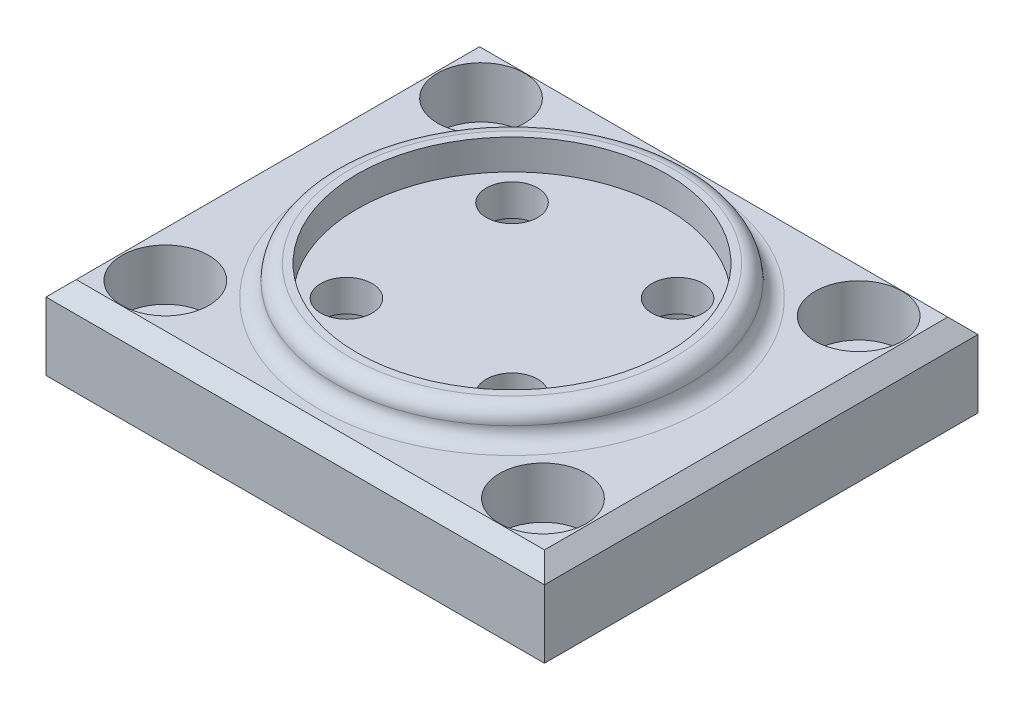
ISO-10303-21;
HEADER;
FILE_DESCRIPTION(('STEP AP214'),'2;1');
FILE_NAME('part.step','',(''),(''),'','','');
FILE_SCHEMA(('AUTOMOTIVE_DESIGN { 1 0 10303 214 1 1 1 1 }'));
ENDSEC;
DATA;
#1=APPLICATION_CONTEXT('core data for automotive mechanical design processes');
#2=APPLICATION_PROTOCOL_DEFINITION('international standard','automotive_design',2000,#1);
#3=PRODUCT_CONTEXT('',#1,'mechanical');
#4=PRODUCT('Part','Part','',(#3));
#5=PRODUCT_RELATED_PRODUCT_CATEGORY('part','',(#4));
#6=PRODUCT_DEFINITION_FORMATION('','',#4);
#7=PRODUCT_DEFINITION_CONTEXT('part definition',#1,'design');
#8=PRODUCT_DEFINITION('design','',#6,#7);
#9=PRODUCT_DEFINITION_SHAPE('','',#8);
#10=(LENGTH_UNIT() NAMED_UNIT(*) SI_UNIT(.MILLI.,.METRE.));
#11=(NAMED_UNIT(*) PLANE_ANGLE_UNIT() SI_UNIT($,.RADIAN.));
#12=(NAMED_UNIT(*) SI_UNIT($,.STERADIAN.) SOLID_ANGLE_UNIT());
#13=UNCERTAINTY_MEASURE_WITH_UNIT(LENGTH_MEASURE(1.E-05),#10,'distance_accuracy_value','');
#14=(GEOMETRIC_REPRESENTATION_CONTEXT(3) GLOBAL_UNCERTAINTY_ASSIGNED_CONTEXT((#13)) GLOBAL_UNIT_ASSIGNED_CONTEXT((#10,
#11,#12)) REPRESENTATION_CONTEXT('',''));
#15=CARTESIAN_POINT('',(0.,0.,0.));
#16=DIRECTION('',(0.,0.,1.));
#17=DIRECTION('',(1.,0.,0.));
#18=AXIS2_PLACEMENT_3D('',#15,#16,#17);
#19=CARTESIAN_POINT('',(0.,5.5,0.));
#20=DIRECTION('',(0.,1.,0.));
#21=DIRECTION('',(0.,0.,1.));
#22=AXIS2_PLACEMENT_3D('',#19,#20,#21);
#23=PLANE('',#22);
#24=CARTESIAN_POINT('',(5.48007755419574,5.5,-5.48007755419574));
#25=DIRECTION('',(0.,-1.,0.));
#26=DIRECTION('',(0.,0.,-1.));
#27=AXIS2_PLACEMENT_3D('',#24,#25,#26);
#28=CIRCLE('',#27,1.7);
#29=CARTESIAN_POINT('',(5.48007755419574,5.5,-7.18007755419574));
#30=VERTEX_POINT('',#29);
#31=EDGE_CURVE('E623',#30,#30,#28,.T.);
#32=ORIENTED_EDGE('',*,*,#31,.T.);
#33=EDGE_LOOP('',(#32));
#34=FACE_BOUND('',#33,.T.);
#35=CARTESIAN_POINT('',(-5.48007755419574,5.5,5.48007755419574));
#36=DIRECTION('',(0.,-1.,0.));
#37=DIRECTION('',(0.,0.,-1.));
#38=AXIS2_PLACEMENT_3D('',#35,#36,#37);
#39=CIRCLE('',#38,1.7);
#40=CARTESIAN_POINT('',(-5.48007755419574,5.5,3.78007755419574));
#41=VERTEX_POINT('',#40);
#42=EDGE_CURVE('E634',#41,#41,#39,.T.);
#43=ORIENTED_EDGE('',*,*,#42,.T.);
#44=EDGE_LOOP('',(#43));
#45=FACE_BOUND('',#44,.T.);
#46=CARTESIAN_POINT('',(-5.48007755419574,5.5,-5.48007755419575));
#47=DIRECTION('',(0.,-1.,0.));
#48=DIRECTION('',(0.,0.,-1.));
#49=AXIS2_PLACEMENT_3D('',#46,#47,#48);
#50=CIRCLE('',#49,1.7);
#51=CARTESIAN_POINT('',(-5.48007755419574,5.5,-7.18007755419575));
#52=VERTEX_POINT('',#51);
#53=EDGE_CURVE('E646',#52,#52,#50,.T.);
#54=ORIENTED_EDGE('',*,*,#53,.T.);
#55=EDGE_LOOP('',(#54));
#56=FACE_BOUND('',#55,.T.);
#57=CARTESIAN_POINT('',(5.48007755419574,5.5,5.48007755419574));
#58=DIRECTION('',(0.,-1.,0.));
#59=DIRECTION('',(0.,0.,-1.));
#60=AXIS2_PLACEMENT_3D('',#57,#58,#59);
#61=CIRCLE('',#60,1.7);
#62=CARTESIAN_POINT('',(5.48007755419574,5.5,3.78007755419575));
#63=VERTEX_POINT('',#62);
#64=EDGE_CURVE('E658',#63,#63,#61,.T.);
#65=ORIENTED_EDGE('',*,*,#64,.T.);
#66=EDGE_LOOP('',(#65));
#67=FACE_BOUND('',#66,.T.);
#68=CARTESIAN_POINT('',(0.,5.5,0.));
#69=DIRECTION('',(0.,1.,0.));
#70=DIRECTION('',(0.,0.,1.));
#71=AXIS2_PLACEMENT_3D('',#68,#69,#70);
#72=CIRCLE('',#71,10.25);
#73=CARTESIAN_POINT('',(0.,5.5,10.25));
#74=VERTEX_POINT('',#73);
#75=EDGE_CURVE('E136',#74,#74,#72,.T.);
#76=ORIENTED_EDGE('',*,*,#75,.T.);
#77=EDGE_LOOP('',(#76));
#78=FACE_BOUND('',#77,.T.);
#79=ADVANCED_FACE('F41',(#34,#45,#56,#67,#78),#23,.T.);
#80=CARTESIAN_POINT('',(-16.5,5.5,14.35));
#81=DIRECTION('',(1.,0.,0.));
#82=DIRECTION('',(0.,0.,-1.));
#83=AXIS2_PLACEMENT_3D('',#80,#81,#82);
#84=PLANE('',#83);
#85=DIRECTION('',(0.,-1.,0.));
#86=VECTOR('',#85,1.);
#87=CARTESIAN_POINT('',(-16.5,5.5,14.35));
#88=LINE('',#87,#86);
#89=CARTESIAN_POINT('',(-16.5,4.5,14.35));
#90=VERTEX_POINT('',#89);
#91=CARTESIAN_POINT('',(-16.5,0.,14.35));
#92=VERTEX_POINT('',#91);
#93=EDGE_CURVE('E93',#90,#92,#88,.T.);
#94=ORIENTED_EDGE('',*,*,#93,.F.);
#95=DIRECTION('',(0.,0.,-1.));
#96=VECTOR('',#95,1.);
#97=CARTESIAN_POINT('',(-16.5,4.5,-14.35));
#98=LINE('',#97,#96);
#99=CARTESIAN_POINT('',(-16.5,4.5,-14.35));
#100=VERTEX_POINT('',#99);
#101=EDGE_CURVE('E51',#90,#100,#98,.T.);
#102=ORIENTED_EDGE('',*,*,#101,.T.);
#103=DIRECTION('',(0.,-1.,0.));
#104=VECTOR('',#103,1.);
#105=CARTESIAN_POINT('',(-16.5,5.5,-14.35));
#106=LINE('',#105,#104);
#107=CARTESIAN_POINT('',(-16.5,0.,-14.35));
#108=VERTEX_POINT('',#107);
#109=EDGE_CURVE('E111',#100,#108,#106,.T.);
#110=ORIENTED_EDGE('',*,*,#109,.T.);
#111=DIRECTION('',(0.,0.,1.));
#112=VECTOR('',#111,1.);
#113=CARTESIAN_POINT('',(-16.5,0.,14.35));
#114=LINE('',#113,#112);
#115=EDGE_CURVE('E106',#108,#92,#114,.T.);
#116=ORIENTED_EDGE('',*,*,#115,.T.);
#117=EDGE_LOOP('',(#94,#102,#110,#116));
#118=FACE_BOUND('',#117,.T.);
#119=ADVANCED_FACE('F110',(#118),#84,.F.);
#120=CARTESIAN_POINT('',(16.5,5.5,14.35));
#121=DIRECTION('',(0.,0.,-1.));
#122=DIRECTION('',(-1.,0.,0.));
#123=AXIS2_PLACEMENT_3D('',#120,#121,#122);
#124=PLANE('',#123);
#125=DIRECTION('',(0.,-1.,0.));
#126=VECTOR('',#125,1.);
#127=CARTESIAN_POINT('',(16.5,5.5,14.35));
#128=LINE('',#127,#126);
#129=CARTESIAN_POINT('',(16.5,4.5,14.35));
#130=VERTEX_POINT('',#129);
#131=CARTESIAN_POINT('',(16.5,0.,14.35));
#132=VERTEX_POINT('',#131);
#133=EDGE_CURVE('E100',#130,#132,#128,.T.);
#134=ORIENTED_EDGE('',*,*,#133,.F.);
#135=DIRECTION('',(-1.,0.,0.));
#136=VECTOR('',#135,1.);
#137=CARTESIAN_POINT('',(-16.5,4.5,14.35));
#138=LINE('',#137,#136);
#139=EDGE_CURVE('E11',#130,#90,#138,.T.);
#140=ORIENTED_EDGE('',*,*,#139,.T.);
#141=ORIENTED_EDGE('',*,*,#93,.T.);
#142=DIRECTION('',(1.,0.,0.));
#143=VECTOR('',#142,1.);
#144=CARTESIAN_POINT('',(16.5,0.,14.35));
#145=LINE('',#144,#143);
#146=EDGE_CURVE('E96',#92,#132,#145,.T.);
#147=ORIENTED_EDGE('',*,*,#146,.T.);
#148=EDGE_LOOP('',(#134,#140,#141,#147));
#149=FACE_BOUND('',#148,.T.);
#150=ADVANCED_FACE('F95',(#149),#124,.F.);
#151=CARTESIAN_POINT('',(16.5,5.5,14.35));
#152=DIRECTION('',(-1.,0.,0.));
#153=DIRECTION('',(0.,0.,1.));
#154=AXIS2_PLACEMENT_3D('',#151,#152,#153);
#155=PLANE('',#154);
#156=DIRECTION('',(0.,-1.,0.));
#157=VECTOR('',#156,1.);
#158=CARTESIAN_POINT('',(16.5,5.5,-14.35));
#159=LINE('',#158,#157);
#160=CARTESIAN_POINT('',(16.5,4.5,-14.35));
#161=VERTEX_POINT('',#160);
#162=CARTESIAN_POINT('',(16.5,0.,-14.35));
#163=VERTEX_POINT('',#162);
#164=EDGE_CURVE('E124',#161,#163,#159,.T.);
#165=ORIENTED_EDGE('',*,*,#164,.F.);
#166=DIRECTION('',(0.,0.,1.));
#167=VECTOR('',#166,1.);
#168=CARTESIAN_POINT('',(16.5,4.5,14.35));
#169=LINE('',#168,#167);
#170=EDGE_CURVE('E145',#161,#130,#169,.T.);
#171=ORIENTED_EDGE('',*,*,#170,.T.);
#172=ORIENTED_EDGE('',*,*,#133,.T.);
#173=DIRECTION('',(0.,0.,-1.));
#174=VECTOR('',#173,1.);
#175=CARTESIAN_POINT('',(16.5,0.,14.35));
#176=LINE('',#175,#174);
#177=EDGE_CURVE('E108',#132,#163,#176,.T.);
#178=ORIENTED_EDGE('',*,*,#177,.T.);
#179=EDGE_LOOP('',(#165,#171,#172,#178));
#180=FACE_BOUND('',#179,.T.);
#181=ADVANCED_FACE('F175',(#180),#155,.F.);
#182=CARTESIAN_POINT('',(16.5,5.5,-14.35));
#183=DIRECTION('',(0.,0.,1.));
#184=DIRECTION('',(1.,0.,0.));
#185=AXIS2_PLACEMENT_3D('',#182,#183,#184);
#186=PLANE('',#185);
#187=ORIENTED_EDGE('',*,*,#109,.F.);
#188=DIRECTION('',(1.,0.,0.));
#189=VECTOR('',#188,1.);
#190=CARTESIAN_POINT('',(16.5,4.5,-14.35));
#191=LINE('',#190,#189);
#192=EDGE_CURVE('E148',#100,#161,#191,.T.);
#193=ORIENTED_EDGE('',*,*,#192,.T.);
#194=ORIENTED_EDGE('',*,*,#164,.T.);
#195=DIRECTION('',(-1.,0.,0.));
#196=VECTOR('',#195,1.);
#197=CARTESIAN_POINT('',(16.5,0.,-14.35));
#198=LINE('',#197,#196);
#199=EDGE_CURVE('E121',#163,#108,#198,.T.);
#200=ORIENTED_EDGE('',*,*,#199,.T.);
#201=EDGE_LOOP('',(#187,#193,#194,#200));
#202=FACE_BOUND('',#201,.T.);
#203=ADVANCED_FACE('F172',(#202),#186,.F.);
#204=DIRECTION('',(1.,0.,0.));
#205=VECTOR('',#204,1.);
#206=CARTESIAN_POINT('',(16.5,5.5,13.35));
#207=LINE('',#206,#205);
#208=CARTESIAN_POINT('',(-15.5,5.5,13.35));
#209=VERTEX_POINT('',#208);
#210=CARTESIAN_POINT('',(15.5,5.5,13.35));
#211=VERTEX_POINT('',#210);
#212=EDGE_CURVE('E132',#209,#211,#207,.T.);
#213=ORIENTED_EDGE('',*,*,#212,.T.);
#214=DIRECTION('',(0.,0.,-1.));
#215=VECTOR('',#214,1.);
#216=CARTESIAN_POINT('',(15.5,5.5,-14.35));
#217=LINE('',#216,#215);
#218=CARTESIAN_POINT('',(15.5,5.5,-13.35));
#219=VERTEX_POINT('',#218);
#220=EDGE_CURVE('E142',#211,#219,#217,.T.);
#221=ORIENTED_EDGE('',*,*,#220,.T.);
#222=DIRECTION('',(-1.,0.,0.));
#223=VECTOR('',#222,1.);
#224=CARTESIAN_POINT('',(-16.5,5.5,-13.35));
#225=LINE('',#224,#223);
#226=CARTESIAN_POINT('',(-15.5,5.5,-13.35));
#227=VERTEX_POINT('',#226);
#228=EDGE_CURVE('E140',#219,#227,#225,.T.);
#229=ORIENTED_EDGE('',*,*,#228,.T.);
#230=DIRECTION('',(0.,0.,1.));
#231=VECTOR('',#230,1.);
#232=CARTESIAN_POINT('',(-15.5,5.5,14.35));
#233=LINE('',#232,#231);
#234=EDGE_CURVE('E138',#227,#209,#233,.T.);
#235=ORIENTED_EDGE('',*,*,#234,.T.);
#236=EDGE_LOOP('',(#213,#221,#229,#235));
#237=FACE_BOUND('',#236,.T.);
#238=CARTESIAN_POINT('',(0.,5.5,0.));
#239=DIRECTION('',(0.,1.,0.));
#240=DIRECTION('',(0.,0.,1.));
#241=AXIS2_PLACEMENT_3D('',#238,#239,#240);
#242=CIRCLE('',#241,12.75);
#243=CARTESIAN_POINT('',(0.,5.5,12.75));
#244=VERTEX_POINT('',#243);
#245=EDGE_CURVE('E129',#244,#244,#242,.F.);
#246=ORIENTED_EDGE('',*,*,#245,.T.);
#247=EDGE_LOOP('',(#246));
#248=FACE_BOUND('',#247,.T.);
#249=CARTESIAN_POINT('',(-12.5,5.5,-10.45));
#250=DIRECTION('',(0.,1.,0.));
#251=DIRECTION('',(0.,0.,1.));
#252=AXIS2_PLACEMENT_3D('',#249,#250,#251);
#253=CIRCLE('',#252,2.875);
#254=CARTESIAN_POINT('',(-12.5,5.5,-7.57499999999999));
#255=VERTEX_POINT('',#254);
#256=EDGE_CURVE('E189',#255,#255,#253,.T.);
#257=ORIENTED_EDGE('',*,*,#256,.F.);
#258=EDGE_LOOP('',(#257));
#259=FACE_BOUND('',#258,.T.);
#260=CARTESIAN_POINT('',(12.5,5.5,10.45));
#261=DIRECTION('',(0.,1.,0.));
#262=DIRECTION('',(0.,0.,1.));
#263=AXIS2_PLACEMENT_3D('',#260,#261,#262);
#264=CIRCLE('',#263,2.875);
#265=CARTESIAN_POINT('',(12.5,5.5,13.325));
#266=VERTEX_POINT('',#265);
#267=EDGE_CURVE('E193',#266,#266,#264,.T.);
#268=ORIENTED_EDGE('',*,*,#267,.F.);
#269=EDGE_LOOP('',(#268));
#270=FACE_BOUND('',#269,.T.);
#271=CARTESIAN_POINT('',(12.5,5.5,-10.45));
#272=DIRECTION('',(0.,1.,0.));
#273=DIRECTION('',(0.,0.,1.));
#274=AXIS2_PLACEMENT_3D('',#271,#272,#273);
#275=CIRCLE('',#274,2.875);
#276=CARTESIAN_POINT('',(12.5,5.5,-7.575));
#277=VERTEX_POINT('',#276);
#278=EDGE_CURVE('E197',#277,#277,#275,.T.);
#279=ORIENTED_EDGE('',*,*,#278,.F.);
#280=EDGE_LOOP('',(#279));
#281=FACE_BOUND('',#280,.T.);
#282=CARTESIAN_POINT('',(-12.5,5.5,10.45));
#283=DIRECTION('',(0.,1.,0.));
#284=DIRECTION('',(0.,0.,1.));
#285=AXIS2_PLACEMENT_3D('',#282,#283,#284);
#286=CIRCLE('',#285,2.875);
#287=CARTESIAN_POINT('',(-12.5,5.5,13.325));
#288=VERTEX_POINT('',#287);
#289=EDGE_CURVE('E200',#288,#288,#286,.T.);
#290=ORIENTED_EDGE('',*,*,#289,.F.);
#291=EDGE_LOOP('',(#290));
#292=FACE_BOUND('',#291,.T.);
#293=ADVANCED_FACE('F180',(#237,#248,#259,#270,#281,#292),#23,.T.);
#294=CARTESIAN_POINT('',(0.,0.,0.));
#295=DIRECTION('',(0.,1.,0.));
#296=DIRECTION('',(0.,0.,1.));
#297=AXIS2_PLACEMENT_3D('',#294,#295,#296);
#298=PLANE('',#297);
#299=CARTESIAN_POINT('',(5.48007755419574,0.,5.48007755419574));
#300=DIRECTION('',(0.,-1.,0.));
#301=DIRECTION('',(0.,0.,-1.));
#302=AXIS2_PLACEMENT_3D('',#299,#300,#301);
#303=CIRCLE('',#302,2.87499999999999);
#304=CARTESIAN_POINT('',(5.48007755419574,0.,2.60507755419575));
#305=VERTEX_POINT('',#304);
#306=EDGE_CURVE('E667',#305,#305,#303,.T.);
#307=ORIENTED_EDGE('',*,*,#306,.F.);
#308=EDGE_LOOP('',(#307));
#309=FACE_BOUND('',#308,.T.);
#310=CARTESIAN_POINT('',(-5.48007755419574,0.,-5.48007755419575));
#311=DIRECTION('',(0.,-1.,0.));
#312=DIRECTION('',(0.,0.,-1.));
#313=AXIS2_PLACEMENT_3D('',#310,#311,#312);
#314=CIRCLE('',#313,2.875);
#315=CARTESIAN_POINT('',(-5.48007755419574,0.,-8.35507755419574));
#316=VERTEX_POINT('',#315);
#317=EDGE_CURVE('E655',#316,#316,#314,.T.);
#318=ORIENTED_EDGE('',*,*,#317,.F.);
#319=EDGE_LOOP('',(#318));
#320=FACE_BOUND('',#319,.T.);
#321=CARTESIAN_POINT('',(-5.48007755419574,0.,5.48007755419574));
#322=DIRECTION('',(0.,-1.,0.));
#323=DIRECTION('',(0.,0.,-1.));
#324=AXIS2_PLACEMENT_3D('',#321,#322,#323);
#325=CIRCLE('',#324,2.875);
#326=CARTESIAN_POINT('',(-5.48007755419574,0.,2.60507755419575));
#327=VERTEX_POINT('',#326);
#328=EDGE_CURVE('E643',#327,#327,#325,.T.);
#329=ORIENTED_EDGE('',*,*,#328,.F.);
#330=EDGE_LOOP('',(#329));
#331=FACE_BOUND('',#330,.T.);
#332=CARTESIAN_POINT('',(5.48007755419574,0.,-5.48007755419574));
#333=DIRECTION('',(0.,-1.,0.));
#334=DIRECTION('',(0.,0.,-1.));
#335=AXIS2_PLACEMENT_3D('',#332,#333,#334);
#336=CIRCLE('',#335,2.875);
#337=CARTESIAN_POINT('',(5.48007755419574,0.,-8.35507755419574));
#338=VERTEX_POINT('',#337);
#339=EDGE_CURVE('E631',#338,#338,#336,.T.);
#340=ORIENTED_EDGE('',*,*,#339,.F.);
#341=EDGE_LOOP('',(#340));
#342=FACE_BOUND('',#341,.T.);
#343=CARTESIAN_POINT('',(-12.5,0.,-10.45));
#344=DIRECTION('',(0.,1.,0.));
#345=DIRECTION('',(0.,0.,1.));
#346=AXIS2_PLACEMENT_3D('',#343,#344,#345);
#347=CIRCLE('',#346,1.7);
#348=CARTESIAN_POINT('',(-12.5,0.,-8.75));
#349=VERTEX_POINT('',#348);
#350=EDGE_CURVE('E613',#349,#349,#347,.T.);
#351=ORIENTED_EDGE('',*,*,#350,.T.);
#352=EDGE_LOOP('',(#351));
#353=FACE_BOUND('',#352,.T.);
#354=CARTESIAN_POINT('',(12.5,0.,10.45));
#355=DIRECTION('',(0.,1.,0.));
#356=DIRECTION('',(0.,0.,1.));
#357=AXIS2_PLACEMENT_3D('',#354,#355,#356);
#358=CIRCLE('',#357,1.7);
#359=CARTESIAN_POINT('',(12.5,0.,12.15));
#360=VERTEX_POINT('',#359);
#361=EDGE_CURVE('E601',#360,#360,#358,.T.);
#362=ORIENTED_EDGE('',*,*,#361,.T.);
#363=EDGE_LOOP('',(#362));
#364=FACE_BOUND('',#363,.T.);
#365=CARTESIAN_POINT('',(12.5,0.,-10.45));
#366=DIRECTION('',(0.,1.,0.));
#367=DIRECTION('',(0.,0.,1.));
#368=AXIS2_PLACEMENT_3D('',#365,#366,#367);
#369=CIRCLE('',#368,1.7);
#370=CARTESIAN_POINT('',(12.5,0.,-8.75));
#371=VERTEX_POINT('',#370);
#372=EDGE_CURVE('E203',#371,#371,#369,.T.);
#373=ORIENTED_EDGE('',*,*,#372,.T.);
#374=EDGE_LOOP('',(#373));
#375=FACE_BOUND('',#374,.T.);
#376=CARTESIAN_POINT('',(-12.5,0.,10.45));
#377=DIRECTION('',(0.,1.,0.));
#378=DIRECTION('',(0.,0.,1.));
#379=AXIS2_PLACEMENT_3D('',#376,#377,#378);
#380=CIRCLE('',#379,1.7);
#381=CARTESIAN_POINT('',(-12.5,0.,12.15));
#382=VERTEX_POINT('',#381);
#383=EDGE_CURVE('E113',#382,#382,#380,.T.);
#384=ORIENTED_EDGE('',*,*,#383,.T.);
#385=EDGE_LOOP('',(#384));
#386=FACE_BOUND('',#385,.T.);
#387=ORIENTED_EDGE('',*,*,#115,.F.);
#388=ORIENTED_EDGE('',*,*,#199,.F.);
#389=ORIENTED_EDGE('',*,*,#177,.F.);
#390=ORIENTED_EDGE('',*,*,#146,.F.);
#391=EDGE_LOOP('',(#387,#388,#389,#390));
#392=FACE_BOUND('',#391,.T.);
#393=ADVANCED_FACE('F104',(#309,#320,#331,#342,#353,#364,#375,#386,#392),#298,.F.);
#394=CARTESIAN_POINT('',(-12.5,5.5,10.45));
#395=DIRECTION('',(0.,1.,0.));
#396=DIRECTION('',(0.,0.,1.));
#397=AXIS2_PLACEMENT_3D('',#394,#395,#396);
#398=CYLINDRICAL_SURFACE('',#397,1.7);
#399=ORIENTED_EDGE('',*,*,#383,.F.);
#400=EDGE_LOOP('',(#399));
#401=FACE_BOUND('',#400,.T.);
#402=CARTESIAN_POINT('',(-12.5,2.1,10.45));
#403=DIRECTION('',(0.,1.,0.));
#404=DIRECTION('',(0.,0.,1.));
#405=AXIS2_PLACEMENT_3D('',#402,#403,#404);
#406=CIRCLE('',#405,1.7);
#407=CARTESIAN_POINT('',(-12.5,2.1,12.15));
#408=VERTEX_POINT('',#407);
#409=EDGE_CURVE('E116',#408,#408,#406,.T.);
#410=ORIENTED_EDGE('',*,*,#409,.T.);
#411=EDGE_LOOP('',(#410));
#412=FACE_BOUND('',#411,.T.);
#413=ADVANCED_FACE('F214',(#401,#412),#398,.F.);
#414=CARTESIAN_POINT('',(-10.8,2.1,10.45));
#415=DIRECTION('',(0.,-1.,0.));
#416=DIRECTION('',(0.,0.,-1.));
#417=AXIS2_PLACEMENT_3D('',#414,#415,#416);
#418=PLANE('',#417);
#419=ORIENTED_EDGE('',*,*,#409,.F.);
#420=EDGE_LOOP('',(#419));
#421=FACE_BOUND('',#420,.T.);
#422=CARTESIAN_POINT('',(-12.5,2.1,10.45));
#423=DIRECTION('',(0.,1.,0.));
#424=DIRECTION('',(0.,0.,1.));
#425=AXIS2_PLACEMENT_3D('',#422,#423,#424);
#426=CIRCLE('',#425,2.875);
#427=CARTESIAN_POINT('',(-12.5,2.1,13.325));
#428=VERTEX_POINT('',#427);
#429=EDGE_CURVE('E202',#428,#428,#426,.T.);
#430=ORIENTED_EDGE('',*,*,#429,.T.);
#431=EDGE_LOOP('',(#430));
#432=FACE_BOUND('',#431,.T.);
#433=ADVANCED_FACE('F216',(#421,#432),#418,.F.);
#434=CARTESIAN_POINT('',(-12.5,5.5,10.45));
#435=DIRECTION('',(0.,1.,0.));
#436=DIRECTION('',(0.,0.,1.));
#437=AXIS2_PLACEMENT_3D('',#434,#435,#436);
#438=CYLINDRICAL_SURFACE('',#437,2.875);
#439=ORIENTED_EDGE('',*,*,#429,.F.);
#440=EDGE_LOOP('',(#439));
#441=FACE_BOUND('',#440,.T.);
#442=ORIENTED_EDGE('',*,*,#289,.T.);
#443=EDGE_LOOP('',(#442));
#444=FACE_BOUND('',#443,.T.);
#445=ADVANCED_FACE('F219',(#441,#444),#438,.F.);
#446=CARTESIAN_POINT('',(12.5,5.5,-10.45));
#447=DIRECTION('',(0.,1.,0.));
#448=DIRECTION('',(0.,0.,1.));
#449=AXIS2_PLACEMENT_3D('',#446,#447,#448);
#450=CYLINDRICAL_SURFACE('',#449,1.7);
#451=ORIENTED_EDGE('',*,*,#372,.F.);
#452=EDGE_LOOP('',(#451));
#453=FACE_BOUND('',#452,.T.);
#454=CARTESIAN_POINT('',(12.5,2.1,-10.45));
#455=DIRECTION('',(0.,1.,0.));
#456=DIRECTION('',(0.,0.,1.));
#457=AXIS2_PLACEMENT_3D('',#454,#455,#456);
#458=CIRCLE('',#457,1.7);
#459=CARTESIAN_POINT('',(12.5,2.1,-8.75));
#460=VERTEX_POINT('',#459);
#461=EDGE_CURVE('E208',#460,#460,#458,.T.);
#462=ORIENTED_EDGE('',*,*,#461,.T.);
#463=EDGE_LOOP('',(#462));
#464=FACE_BOUND('',#463,.T.);
#465=ADVANCED_FACE('F224',(#453,#464),#450,.F.);
#466=CARTESIAN_POINT('',(14.2,2.1,-10.45));
#467=DIRECTION('',(0.,-1.,0.));
#468=DIRECTION('',(0.,0.,-1.));
#469=AXIS2_PLACEMENT_3D('',#466,#467,#468);
#470=PLANE('',#469);
#471=ORIENTED_EDGE('',*,*,#461,.F.);
#472=EDGE_LOOP('',(#471));
#473=FACE_BOUND('',#472,.T.);
#474=CARTESIAN_POINT('',(12.5,2.1,-10.45));
#475=DIRECTION('',(0.,1.,0.));
#476=DIRECTION('',(0.,0.,1.));
#477=AXIS2_PLACEMENT_3D('',#474,#475,#476);
#478=CIRCLE('',#477,2.875);
#479=CARTESIAN_POINT('',(12.5,2.1,-7.575));
#480=VERTEX_POINT('',#479);
#481=EDGE_CURVE('E599',#480,#480,#478,.T.);
#482=ORIENTED_EDGE('',*,*,#481,.T.);
#483=EDGE_LOOP('',(#482));
#484=FACE_BOUND('',#483,.T.);
#485=ADVANCED_FACE('F229',(#473,#484),#470,.F.);
#486=CARTESIAN_POINT('',(12.5,5.5,-10.45));
#487=DIRECTION('',(0.,1.,0.));
#488=DIRECTION('',(0.,0.,1.));
#489=AXIS2_PLACEMENT_3D('',#486,#487,#488);
#490=CYLINDRICAL_SURFACE('',#489,2.875);
#491=ORIENTED_EDGE('',*,*,#481,.F.);
#492=EDGE_LOOP('',(#491));
#493=FACE_BOUND('',#492,.T.);
#494=ORIENTED_EDGE('',*,*,#278,.T.);
#495=EDGE_LOOP('',(#494));
#496=FACE_BOUND('',#495,.T.);
#497=ADVANCED_FACE('F518',(#493,#496),#490,.F.);
#498=CARTESIAN_POINT('',(12.5,5.5,10.45));
#499=DIRECTION('',(0.,1.,0.));
#500=DIRECTION('',(0.,0.,1.));
#501=AXIS2_PLACEMENT_3D('',#498,#499,#500);
#502=CYLINDRICAL_SURFACE('',#501,1.7);
#503=ORIENTED_EDGE('',*,*,#361,.F.);
#504=EDGE_LOOP('',(#503));
#505=FACE_BOUND('',#504,.T.);
#506=CARTESIAN_POINT('',(12.5,2.1,10.45));
#507=DIRECTION('',(0.,1.,0.));
#508=DIRECTION('',(0.,0.,1.));
#509=AXIS2_PLACEMENT_3D('',#506,#507,#508);
#510=CIRCLE('',#509,1.7);
#511=CARTESIAN_POINT('',(12.5,2.1,12.15));
#512=VERTEX_POINT('',#511);
#513=EDGE_CURVE('E606',#512,#512,#510,.T.);
#514=ORIENTED_EDGE('',*,*,#513,.T.);
#515=EDGE_LOOP('',(#514));
#516=FACE_BOUND('',#515,.T.);
#517=ADVANCED_FACE('F509',(#505,#516),#502,.F.);
#518=CARTESIAN_POINT('',(14.2,2.1,10.45));
#519=DIRECTION('',(0.,-1.,0.));
#520=DIRECTION('',(0.,0.,-1.));
#521=AXIS2_PLACEMENT_3D('',#518,#519,#520);
#522=PLANE('',#521);
#523=ORIENTED_EDGE('',*,*,#513,.F.);
#524=EDGE_LOOP('',(#523));
#525=FACE_BOUND('',#524,.T.);
#526=CARTESIAN_POINT('',(12.5,2.1,10.45));
#527=DIRECTION('',(0.,1.,0.));
#528=DIRECTION('',(0.,0.,1.));
#529=AXIS2_PLACEMENT_3D('',#526,#527,#528);
#530=CIRCLE('',#529,2.875);
#531=CARTESIAN_POINT('',(12.5,2.1,13.325));
#532=VERTEX_POINT('',#531);
#533=EDGE_CURVE('E609',#532,#532,#530,.T.);
#534=ORIENTED_EDGE('',*,*,#533,.T.);
#535=EDGE_LOOP('',(#534));
#536=FACE_BOUND('',#535,.T.);
#537=ADVANCED_FACE('F500',(#525,#536),#522,.F.);
#538=CARTESIAN_POINT('',(12.5,5.5,10.45));
#539=DIRECTION('',(0.,1.,0.));
#540=DIRECTION('',(0.,0.,1.));
#541=AXIS2_PLACEMENT_3D('',#538,#539,#540);
#542=CYLINDRICAL_SURFACE('',#541,2.875);
#543=ORIENTED_EDGE('',*,*,#533,.F.);
#544=EDGE_LOOP('',(#543));
#545=FACE_BOUND('',#544,.T.);
#546=ORIENTED_EDGE('',*,*,#267,.T.);
#547=EDGE_LOOP('',(#546));
#548=FACE_BOUND('',#547,.T.);
#549=ADVANCED_FACE('F491',(#545,#548),#542,.F.);
#550=CARTESIAN_POINT('',(-12.5,5.5,-10.45));
#551=DIRECTION('',(0.,1.,0.));
#552=DIRECTION('',(0.,0.,1.));
#553=AXIS2_PLACEMENT_3D('',#550,#551,#552);
#554=CYLINDRICAL_SURFACE('',#553,1.7);
#555=ORIENTED_EDGE('',*,*,#350,.F.);
#556=EDGE_LOOP('',(#555));
#557=FACE_BOUND('',#556,.T.);
#558=CARTESIAN_POINT('',(-12.5,2.1,-10.45));
#559=DIRECTION('',(0.,1.,0.));
#560=DIRECTION('',(0.,0.,1.));
#561=AXIS2_PLACEMENT_3D('',#558,#559,#560);
#562=CIRCLE('',#561,1.7);
#563=CARTESIAN_POINT('',(-12.5,2.1,-8.75));
#564=VERTEX_POINT('',#563);
#565=EDGE_CURVE('E616',#564,#564,#562,.T.);
#566=ORIENTED_EDGE('',*,*,#565,.T.);
#567=EDGE_LOOP('',(#566));
#568=FACE_BOUND('',#567,.T.);
#569=ADVANCED_FACE('F482',(#557,#568),#554,.F.);
#570=CARTESIAN_POINT('',(-10.8,2.1,-10.45));
#571=DIRECTION('',(0.,-1.,0.));
#572=DIRECTION('',(0.,0.,-1.));
#573=AXIS2_PLACEMENT_3D('',#570,#571,#572);
#574=PLANE('',#573);
#575=ORIENTED_EDGE('',*,*,#565,.F.);
#576=EDGE_LOOP('',(#575));
#577=FACE_BOUND('',#576,.T.);
#578=CARTESIAN_POINT('',(-12.5,2.1,-10.45));
#579=DIRECTION('',(0.,1.,0.));
#580=DIRECTION('',(0.,0.,1.));
#581=AXIS2_PLACEMENT_3D('',#578,#579,#580);
#582=CIRCLE('',#581,2.875);
#583=CARTESIAN_POINT('',(-12.5,2.1,-7.57499999999999));
#584=VERTEX_POINT('',#583);
#585=EDGE_CURVE('E619',#584,#584,#582,.T.);
#586=ORIENTED_EDGE('',*,*,#585,.T.);
#587=EDGE_LOOP('',(#586));
#588=FACE_BOUND('',#587,.T.);
#589=ADVANCED_FACE('F473',(#577,#588),#574,.F.);
#590=CARTESIAN_POINT('',(-12.5,5.5,-10.45));
#591=DIRECTION('',(0.,1.,0.));
#592=DIRECTION('',(0.,0.,1.));
#593=AXIS2_PLACEMENT_3D('',#590,#591,#592);
#594=CYLINDRICAL_SURFACE('',#593,2.875);
#595=ORIENTED_EDGE('',*,*,#585,.F.);
#596=EDGE_LOOP('',(#595));
#597=FACE_BOUND('',#596,.T.);
#598=ORIENTED_EDGE('',*,*,#256,.T.);
#599=EDGE_LOOP('',(#598));
#600=FACE_BOUND('',#599,.T.);
#601=ADVANCED_FACE('F464',(#597,#600),#594,.F.);
#602=CARTESIAN_POINT('',(5.48007755419574,0.,-5.48007755419574));
#603=DIRECTION('',(0.,-1.,0.));
#604=DIRECTION('',(0.,0.,-1.));
#605=AXIS2_PLACEMENT_3D('',#602,#603,#604);
#606=CYLINDRICAL_SURFACE('',#605,1.70000000000001);
#607=ORIENTED_EDGE('',*,*,#31,.F.);
#608=EDGE_LOOP('',(#607));
#609=FACE_BOUND('',#608,.T.);
#610=CARTESIAN_POINT('',(5.48007755419574,3.4,-5.48007755419574));
#611=DIRECTION('',(0.,-1.,0.));
#612=DIRECTION('',(0.,0.,-1.));
#613=AXIS2_PLACEMENT_3D('',#610,#611,#612);
#614=CIRCLE('',#613,1.70000000000001);
#615=CARTESIAN_POINT('',(5.48007755419574,3.4,-7.18007755419576));
#616=VERTEX_POINT('',#615);
#617=EDGE_CURVE('E625',#616,#616,#614,.T.);
#618=ORIENTED_EDGE('',*,*,#617,.T.);
#619=EDGE_LOOP('',(#618));
#620=FACE_BOUND('',#619,.T.);
#621=ADVANCED_FACE('F455',(#609,#620),#606,.F.);
#622=CARTESIAN_POINT('',(7.18007755419576,3.4,-5.48007755419574));
#623=DIRECTION('',(0.,1.,0.));
#624=DIRECTION('',(0.,0.,1.));
#625=AXIS2_PLACEMENT_3D('',#622,#623,#624);
#626=PLANE('',#625);
#627=ORIENTED_EDGE('',*,*,#617,.F.);
#628=EDGE_LOOP('',(#627));
#629=FACE_BOUND('',#628,.T.);
#630=CARTESIAN_POINT('',(5.48007755419574,3.4,-5.48007755419574));
#631=DIRECTION('',(0.,-1.,0.));
#632=DIRECTION('',(0.,0.,-1.));
#633=AXIS2_PLACEMENT_3D('',#630,#631,#632);
#634=CIRCLE('',#633,2.875);
#635=CARTESIAN_POINT('',(5.48007755419574,3.4,-8.35507755419574));
#636=VERTEX_POINT('',#635);
#637=EDGE_CURVE('E628',#636,#636,#634,.T.);
#638=ORIENTED_EDGE('',*,*,#637,.T.);
#639=EDGE_LOOP('',(#638));
#640=FACE_BOUND('',#639,.T.);
#641=ADVANCED_FACE('F446',(#629,#640),#626,.F.);
#642=CARTESIAN_POINT('',(5.48007755419574,0.,-5.48007755419574));
#643=DIRECTION('',(0.,-1.,0.));
#644=DIRECTION('',(0.,0.,-1.));
#645=AXIS2_PLACEMENT_3D('',#642,#643,#644);
#646=CYLINDRICAL_SURFACE('',#645,2.875);
#647=ORIENTED_EDGE('',*,*,#637,.F.);
#648=EDGE_LOOP('',(#647));
#649=FACE_BOUND('',#648,.T.);
#650=ORIENTED_EDGE('',*,*,#339,.T.);
#651=EDGE_LOOP('',(#650));
#652=FACE_BOUND('',#651,.T.);
#653=ADVANCED_FACE('F437',(#649,#652),#646,.F.);
#654=CARTESIAN_POINT('',(-5.48007755419574,0.,5.48007755419574));
#655=DIRECTION('',(0.,-1.,0.));
#656=DIRECTION('',(0.,0.,-1.));
#657=AXIS2_PLACEMENT_3D('',#654,#655,#656);
#658=CYLINDRICAL_SURFACE('',#657,1.70000000000001);
#659=ORIENTED_EDGE('',*,*,#42,.F.);
#660=EDGE_LOOP('',(#659));
#661=FACE_BOUND('',#660,.T.);
#662=CARTESIAN_POINT('',(-5.48007755419574,3.4,5.48007755419574));
#663=DIRECTION('',(0.,-1.,0.));
#664=DIRECTION('',(0.,0.,-1.));
#665=AXIS2_PLACEMENT_3D('',#662,#663,#664);
#666=CIRCLE('',#665,1.70000000000001);
#667=CARTESIAN_POINT('',(-5.48007755419574,3.4,3.78007755419573));
#668=VERTEX_POINT('',#667);
#669=EDGE_CURVE('E637',#668,#668,#666,.T.);
#670=ORIENTED_EDGE('',*,*,#669,.T.);
#671=EDGE_LOOP('',(#670));
#672=FACE_BOUND('',#671,.T.);
#673=ADVANCED_FACE('F428',(#661,#672),#658,.F.);
#674=CARTESIAN_POINT('',(-3.78007755419573,3.4,5.48007755419574));
#675=DIRECTION('',(0.,1.,0.));
#676=DIRECTION('',(0.,0.,1.));
#677=AXIS2_PLACEMENT_3D('',#674,#675,#676);
#678=PLANE('',#677);
#679=ORIENTED_EDGE('',*,*,#669,.F.);
#680=EDGE_LOOP('',(#679));
#681=FACE_BOUND('',#680,.T.);
#682=CARTESIAN_POINT('',(-5.48007755419574,3.4,5.48007755419574));
#683=DIRECTION('',(0.,-1.,0.));
#684=DIRECTION('',(0.,0.,-1.));
#685=AXIS2_PLACEMENT_3D('',#682,#683,#684);
#686=CIRCLE('',#685,2.875);
#687=CARTESIAN_POINT('',(-5.48007755419574,3.4,2.60507755419575));
#688=VERTEX_POINT('',#687);
#689=EDGE_CURVE('E640',#688,#688,#686,.T.);
#690=ORIENTED_EDGE('',*,*,#689,.T.);
#691=EDGE_LOOP('',(#690));
#692=FACE_BOUND('',#691,.T.);
#693=ADVANCED_FACE('F419',(#681,#692),#678,.F.);
#694=CARTESIAN_POINT('',(-5.48007755419574,0.,5.48007755419574));
#695=DIRECTION('',(0.,-1.,0.));
#696=DIRECTION('',(0.,0.,-1.));
#697=AXIS2_PLACEMENT_3D('',#694,#695,#696);
#698=CYLINDRICAL_SURFACE('',#697,2.875);
#699=ORIENTED_EDGE('',*,*,#689,.F.);
#700=EDGE_LOOP('',(#699));
#701=FACE_BOUND('',#700,.T.);
#702=ORIENTED_EDGE('',*,*,#328,.T.);
#703=EDGE_LOOP('',(#702));
#704=FACE_BOUND('',#703,.T.);
#705=ADVANCED_FACE('F410',(#701,#704),#698,.F.);
#706=CARTESIAN_POINT('',(-5.48007755419574,0.,-5.48007755419575));
#707=DIRECTION('',(0.,-1.,0.));
#708=DIRECTION('',(0.,0.,-1.));
#709=AXIS2_PLACEMENT_3D('',#706,#707,#708);
#710=CYLINDRICAL_SURFACE('',#709,1.70000000000001);
#711=ORIENTED_EDGE('',*,*,#53,.F.);
#712=EDGE_LOOP('',(#711));
#713=FACE_BOUND('',#712,.T.);
#714=CARTESIAN_POINT('',(-5.48007755419574,3.4,-5.48007755419575));
#715=DIRECTION('',(0.,-1.,0.));
#716=DIRECTION('',(0.,0.,-1.));
#717=AXIS2_PLACEMENT_3D('',#714,#715,#716);
#718=CIRCLE('',#717,1.70000000000001);
#719=CARTESIAN_POINT('',(-5.48007755419574,3.4,-7.18007755419576));
#720=VERTEX_POINT('',#719);
#721=EDGE_CURVE('E649',#720,#720,#718,.T.);
#722=ORIENTED_EDGE('',*,*,#721,.T.);
#723=EDGE_LOOP('',(#722));
#724=FACE_BOUND('',#723,.T.);
#725=ADVANCED_FACE('F401',(#713,#724),#710,.F.);
#726=CARTESIAN_POINT('',(-3.78007755419573,3.4,-5.48007755419575));
#727=DIRECTION('',(0.,1.,0.));
#728=DIRECTION('',(0.,0.,1.));
#729=AXIS2_PLACEMENT_3D('',#726,#727,#728);
#730=PLANE('',#729);
#731=ORIENTED_EDGE('',*,*,#721,.F.);
#732=EDGE_LOOP('',(#731));
#733=FACE_BOUND('',#732,.T.);
#734=CARTESIAN_POINT('',(-5.48007755419574,3.4,-5.48007755419575));
#735=DIRECTION('',(0.,-1.,0.));
#736=DIRECTION('',(0.,0.,-1.));
#737=AXIS2_PLACEMENT_3D('',#734,#735,#736);
#738=CIRCLE('',#737,2.875);
#739=CARTESIAN_POINT('',(-5.48007755419574,3.4,-8.35507755419574));
#740=VERTEX_POINT('',#739);
#741=EDGE_CURVE('E652',#740,#740,#738,.T.);
#742=ORIENTED_EDGE('',*,*,#741,.T.);
#743=EDGE_LOOP('',(#742));
#744=FACE_BOUND('',#743,.T.);
#745=ADVANCED_FACE('F392',(#733,#744),#730,.F.);
#746=CARTESIAN_POINT('',(-5.48007755419574,0.,-5.48007755419575));
#747=DIRECTION('',(0.,-1.,0.));
#748=DIRECTION('',(0.,0.,-1.));
#749=AXIS2_PLACEMENT_3D('',#746,#747,#748);
#750=CYLINDRICAL_SURFACE('',#749,2.875);
#751=ORIENTED_EDGE('',*,*,#741,.F.);
#752=EDGE_LOOP('',(#751));
#753=FACE_BOUND('',#752,.T.);
#754=ORIENTED_EDGE('',*,*,#317,.T.);
#755=EDGE_LOOP('',(#754));
#756=FACE_BOUND('',#755,.T.);
#757=ADVANCED_FACE('F383',(#753,#756),#750,.F.);
#758=CARTESIAN_POINT('',(5.48007755419574,0.,5.48007755419574));
#759=DIRECTION('',(0.,-1.,0.));
#760=DIRECTION('',(0.,0.,-1.));
#761=AXIS2_PLACEMENT_3D('',#758,#759,#760);
#762=CYLINDRICAL_SURFACE('',#761,1.70000000000001);
#763=ORIENTED_EDGE('',*,*,#64,.F.);
#764=EDGE_LOOP('',(#763));
#765=FACE_BOUND('',#764,.T.);
#766=CARTESIAN_POINT('',(5.48007755419574,3.4,5.48007755419574));
#767=DIRECTION('',(0.,-1.,0.));
#768=DIRECTION('',(0.,0.,-1.));
#769=AXIS2_PLACEMENT_3D('',#766,#767,#768);
#770=CIRCLE('',#769,1.70000000000001);
#771=CARTESIAN_POINT('',(5.48007755419574,3.4,3.78007755419573));
#772=VERTEX_POINT('',#771);
#773=EDGE_CURVE('E661',#772,#772,#770,.T.);
#774=ORIENTED_EDGE('',*,*,#773,.T.);
#775=EDGE_LOOP('',(#774));
#776=FACE_BOUND('',#775,.T.);
#777=ADVANCED_FACE('F374',(#765,#776),#762,.F.);
#778=CARTESIAN_POINT('',(7.18007755419575,3.4,5.48007755419574));
#779=DIRECTION('',(0.,1.,0.));
#780=DIRECTION('',(0.,0.,1.));
#781=AXIS2_PLACEMENT_3D('',#778,#779,#780);
#782=PLANE('',#781);
#783=ORIENTED_EDGE('',*,*,#773,.F.);
#784=EDGE_LOOP('',(#783));
#785=FACE_BOUND('',#784,.T.);
#786=CARTESIAN_POINT('',(5.48007755419574,3.4,5.48007755419574));
#787=DIRECTION('',(0.,-1.,0.));
#788=DIRECTION('',(0.,0.,-1.));
#789=AXIS2_PLACEMENT_3D('',#786,#787,#788);
#790=CIRCLE('',#789,2.87499999999999);
#791=CARTESIAN_POINT('',(5.48007755419574,3.4,2.60507755419575));
#792=VERTEX_POINT('',#791);
#793=EDGE_CURVE('E664',#792,#792,#790,.T.);
#794=ORIENTED_EDGE('',*,*,#793,.T.);
#795=EDGE_LOOP('',(#794));
#796=FACE_BOUND('',#795,.T.);
#797=ADVANCED_FACE('F365',(#785,#796),#782,.F.);
#798=CARTESIAN_POINT('',(5.48007755419574,0.,5.48007755419574));
#799=DIRECTION('',(0.,-1.,0.));
#800=DIRECTION('',(0.,0.,-1.));
#801=AXIS2_PLACEMENT_3D('',#798,#799,#800);
#802=CYLINDRICAL_SURFACE('',#801,2.87499999999999);
#803=ORIENTED_EDGE('',*,*,#793,.F.);
#804=EDGE_LOOP('',(#803));
#805=FACE_BOUND('',#804,.T.);
#806=ORIENTED_EDGE('',*,*,#306,.T.);
#807=EDGE_LOOP('',(#806));
#808=FACE_BOUND('',#807,.T.);
#809=ADVANCED_FACE('F324',(#805,#808),#802,.F.);
#810=CARTESIAN_POINT('',(0.,7.5,0.));
#811=DIRECTION('',(0.,1.,0.));
#812=DIRECTION('',(0.,0.,1.));
#813=AXIS2_PLACEMENT_3D('',#810,#811,#812);
#814=PLANE('',#813);
#815=CARTESIAN_POINT('',(0.,7.5,0.));
#816=DIRECTION('',(0.,1.,0.));
#817=DIRECTION('',(0.,0.,1.));
#818=AXIS2_PLACEMENT_3D('',#815,#816,#817);
#819=CIRCLE('',#818,10.75);
#820=CARTESIAN_POINT('',(0.,7.5,10.75));
#821=VERTEX_POINT('',#820);
#822=EDGE_CURVE('E99',#821,#821,#819,.T.);
#823=ORIENTED_EDGE('',*,*,#822,.T.);
#824=EDGE_LOOP('',(#823));
#825=FACE_BOUND('',#824,.T.);
#826=CARTESIAN_POINT('',(0.,7.5,0.));
#827=DIRECTION('',(0.,1.,0.));
#828=DIRECTION('',(0.,0.,1.));
#829=AXIS2_PLACEMENT_3D('',#826,#827,#828);
#830=CIRCLE('',#829,10.25);
#831=CARTESIAN_POINT('',(0.,7.5,10.25));
#832=VERTEX_POINT('',#831);
#833=EDGE_CURVE('E670',#832,#832,#830,.T.);
#834=ORIENTED_EDGE('',*,*,#833,.F.);
#835=EDGE_LOOP('',(#834));
#836=FACE_BOUND('',#835,.T.);
#837=ADVANCED_FACE('F321',(#825,#836),#814,.T.);
#838=CARTESIAN_POINT('',(0.,7.5,0.));
#839=DIRECTION('',(0.,-1.,0.));
#840=DIRECTION('',(0.,0.,-1.));
#841=AXIS2_PLACEMENT_3D('',#838,#839,#840);
#842=CYLINDRICAL_SURFACE('',#841,10.25);
#843=ORIENTED_EDGE('',*,*,#833,.T.);
#844=EDGE_LOOP('',(#843));
#845=FACE_BOUND('',#844,.T.);
#846=ORIENTED_EDGE('',*,*,#75,.F.);
#847=EDGE_LOOP('',(#846));
#848=FACE_BOUND('',#847,.T.);
#849=ADVANCED_FACE('F260',(#845,#848),#842,.F.);
#850=CARTESIAN_POINT('',(0.,6.5,0.));
#851=DIRECTION('',(0.,1.,0.));
#852=DIRECTION('',(0.,0.,1.));
#853=AXIS2_PLACEMENT_3D('',#850,#851,#852);
#854=TOROIDAL_SURFACE('',#853,12.75,1.);
#855=ORIENTED_EDGE('',*,*,#245,.F.);
#856=EDGE_LOOP('',(#855));
#857=FACE_BOUND('',#856,.T.);
#858=CARTESIAN_POINT('',(0.,6.5,0.));
#859=DIRECTION('',(0.,1.,0.));
#860=DIRECTION('',(0.,0.,1.));
#861=AXIS2_PLACEMENT_3D('',#858,#859,#860);
#862=CIRCLE('',#861,11.75);
#863=CARTESIAN_POINT('',(0.,6.5,11.75));
#864=VERTEX_POINT('',#863);
#865=EDGE_CURVE('E133',#864,#864,#862,.T.);
#866=ORIENTED_EDGE('',*,*,#865,.F.);
#867=EDGE_LOOP('',(#866));
#868=FACE_BOUND('',#867,.T.);
#869=ADVANCED_FACE('F256',(#857,#868),#854,.F.);
#870=CARTESIAN_POINT('',(0.,6.5,0.));
#871=DIRECTION('',(0.,1.,0.));
#872=DIRECTION('',(0.,0.,1.));
#873=AXIS2_PLACEMENT_3D('',#870,#871,#872);
#874=TOROIDAL_SURFACE('',#873,10.75,1.);
#875=ORIENTED_EDGE('',*,*,#865,.T.);
#876=EDGE_LOOP('',(#875));
#877=FACE_BOUND('',#876,.T.);
#878=ORIENTED_EDGE('',*,*,#822,.F.);
#879=EDGE_LOOP('',(#878));
#880=FACE_BOUND('',#879,.T.);
#881=ADVANCED_FACE('F253',(#877,#880),#874,.T.);
#882=CARTESIAN_POINT('',(-15.5,5.5,0.));
#883=DIRECTION('',(-0.707106781186547,0.707106781186547,0.));
#884=DIRECTION('',(0.,0.,-1.));
#885=AXIS2_PLACEMENT_3D('',#882,#883,#884);
#886=PLANE('',#885);
#887=DIRECTION('',(-0.577350269189626,-0.577350269189626,-0.577350269189625));
#888=VECTOR('',#887,1.);
#889=CARTESIAN_POINT('',(-11.05,9.95,-8.90000000000002));
#890=LINE('',#889,#888);
#891=EDGE_CURVE('E154',#100,#227,#890,.F.);
#892=ORIENTED_EDGE('',*,*,#891,.F.);
#893=ORIENTED_EDGE('',*,*,#101,.F.);
#894=DIRECTION('',(-0.577350269189626,-0.577350269189626,0.577350269189626));
#895=VECTOR('',#894,1.);
#896=CARTESIAN_POINT('',(-10.3333333333333,10.6666666666667,8.18333333333332));
#897=LINE('',#896,#895);
#898=EDGE_CURVE('E46',#209,#90,#897,.T.);
#899=ORIENTED_EDGE('',*,*,#898,.F.);
#900=ORIENTED_EDGE('',*,*,#234,.F.);
#901=EDGE_LOOP('',(#892,#893,#899,#900));
#902=FACE_BOUND('',#901,.T.);
#903=ADVANCED_FACE('F44',(#902),#886,.T.);
#904=CARTESIAN_POINT('',(0.,5.5,13.35));
#905=DIRECTION('',(0.,0.707106781186547,0.707106781186547));
#906=DIRECTION('',(-1.,0.,0.));
#907=AXIS2_PLACEMENT_3D('',#904,#905,#906);
#908=PLANE('',#907);
#909=ORIENTED_EDGE('',*,*,#898,.T.);
#910=ORIENTED_EDGE('',*,*,#139,.F.);
#911=DIRECTION('',(-0.577350269189626,0.577350269189626,-0.577350269189626));
#912=VECTOR('',#911,1.);
#913=CARTESIAN_POINT('',(10.3333333333333,10.6666666666667,8.18333333333332));
#914=LINE('',#913,#912);
#915=EDGE_CURVE('E153',#211,#130,#914,.F.);
#916=ORIENTED_EDGE('',*,*,#915,.F.);
#917=ORIENTED_EDGE('',*,*,#212,.F.);
#918=EDGE_LOOP('',(#909,#910,#916,#917));
#919=FACE_BOUND('',#918,.T.);
#920=ADVANCED_FACE('F164',(#919),#908,.T.);
#921=CARTESIAN_POINT('',(0.,5.5,-13.35));
#922=DIRECTION('',(0.,0.707106781186547,-0.707106781186548));
#923=DIRECTION('',(1.,0.,0.));
#924=AXIS2_PLACEMENT_3D('',#921,#922,#923);
#925=PLANE('',#924);
#926=ORIENTED_EDGE('',*,*,#891,.T.);
#927=ORIENTED_EDGE('',*,*,#228,.F.);
#928=DIRECTION('',(0.577350269189626,-0.577350269189626,-0.577350269189625));
#929=VECTOR('',#928,1.);
#930=CARTESIAN_POINT('',(10.3333333333333,10.6666666666667,-8.18333333333335));
#931=LINE('',#930,#929);
#932=EDGE_CURVE('E151',#161,#219,#931,.F.);
#933=ORIENTED_EDGE('',*,*,#932,.F.);
#934=ORIENTED_EDGE('',*,*,#192,.F.);
#935=EDGE_LOOP('',(#926,#927,#933,#934));
#936=FACE_BOUND('',#935,.T.);
#937=ADVANCED_FACE('F169',(#936),#925,.T.);
#938=CARTESIAN_POINT('',(15.5,5.5,0.));
#939=DIRECTION('',(0.707106781186547,0.707106781186547,0.));
#940=DIRECTION('',(0.,0.,1.));
#941=AXIS2_PLACEMENT_3D('',#938,#939,#940);
#942=PLANE('',#941);
#943=ORIENTED_EDGE('',*,*,#915,.T.);
#944=ORIENTED_EDGE('',*,*,#170,.F.);
#945=ORIENTED_EDGE('',*,*,#932,.T.);
#946=ORIENTED_EDGE('',*,*,#220,.F.);
#947=EDGE_LOOP('',(#943,#944,#945,#946));
#948=FACE_BOUND('',#947,.T.);
#949=ADVANCED_FACE('F177',(#948),#942,.T.);
#950=CLOSED_SHELL('',(#79,#119,#150,#181,#203,#293,#393,#413,#433,#445,#465,#485,#497,#517,#537,
#549,#569,#589,#601,#621,#641,#653,#673,#693,#705,#725,#745,#757,#777,#797,#809,#837,#849,#869,
#881,#903,#920,#937,#949));
#951=MANIFOLD_SOLID_BREP('B2',#950);
#952=ADVANCED_BREP_SHAPE_REPRESENTATION('',(#18,#951),#14);
#953=SHAPE_DEFINITION_REPRESENTATION(#9,#952);
ENDSEC;
END-ISO-10303-21;
